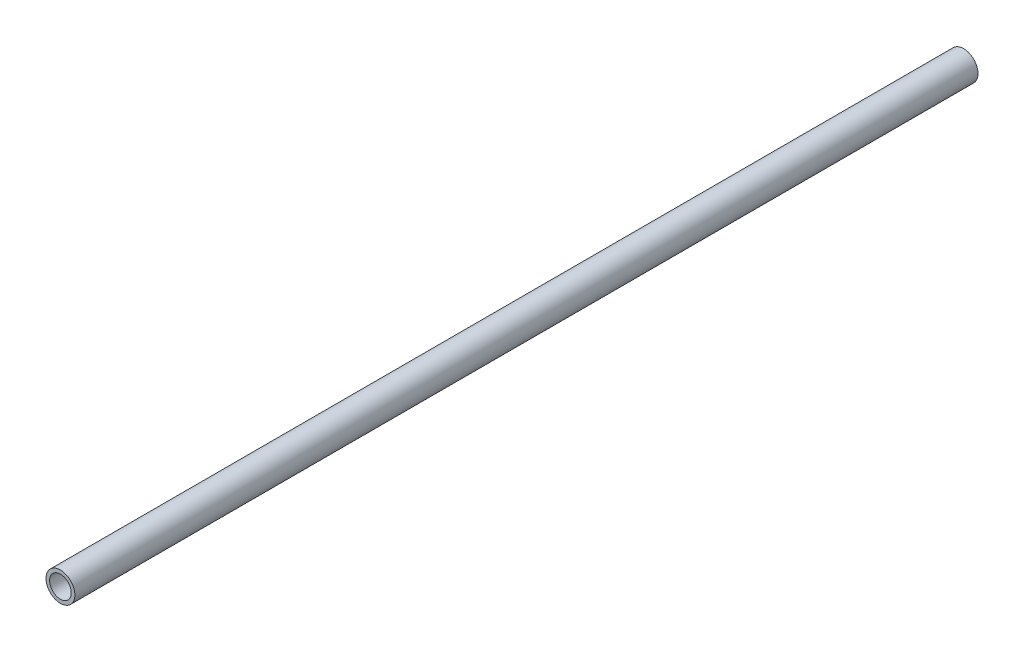
ISO-10303-21;
HEADER;
FILE_DESCRIPTION(('STEP AP214'),'2;1');
FILE_NAME('part.step','',(''),(''),'','','');
FILE_SCHEMA(('AUTOMOTIVE_DESIGN { 1 0 10303 214 1 1 1 1 }'));
ENDSEC;
DATA;
#1=APPLICATION_CONTEXT('core data for automotive mechanical design processes');
#2=APPLICATION_PROTOCOL_DEFINITION('international standard','automotive_design',2000,#1);
#3=PRODUCT_CONTEXT('',#1,'mechanical');
#4=PRODUCT('Part','Part','',(#3));
#5=PRODUCT_RELATED_PRODUCT_CATEGORY('part','',(#4));
#6=PRODUCT_DEFINITION_FORMATION('','',#4);
#7=PRODUCT_DEFINITION_CONTEXT('part definition',#1,'design');
#8=PRODUCT_DEFINITION('design','',#6,#7);
#9=PRODUCT_DEFINITION_SHAPE('','',#8);
#10=(LENGTH_UNIT() NAMED_UNIT(*) SI_UNIT(.MILLI.,.METRE.));
#11=(NAMED_UNIT(*) PLANE_ANGLE_UNIT() SI_UNIT($,.RADIAN.));
#12=(NAMED_UNIT(*) SI_UNIT($,.STERADIAN.) SOLID_ANGLE_UNIT());
#13=UNCERTAINTY_MEASURE_WITH_UNIT(LENGTH_MEASURE(1.E-05),#10,'distance_accuracy_value','');
#14=(GEOMETRIC_REPRESENTATION_CONTEXT(3) GLOBAL_UNCERTAINTY_ASSIGNED_CONTEXT((#13)) GLOBAL_UNIT_ASSIGNED_CONTEXT((#10,
#11,#12)) REPRESENTATION_CONTEXT('',''));
#15=CARTESIAN_POINT('',(0.,0.,0.));
#16=DIRECTION('',(0.,0.,1.));
#17=DIRECTION('',(1.,0.,0.));
#18=AXIS2_PLACEMENT_3D('',#15,#16,#17);
#19=CARTESIAN_POINT('',(0.,0.,250.));
#20=DIRECTION('',(0.,0.,1.));
#21=DIRECTION('',(1.,0.,0.));
#22=AXIS2_PLACEMENT_3D('',#19,#20,#21);
#23=PLANE('',#22);
#24=CARTESIAN_POINT('',(0.,0.,250.));
#25=DIRECTION('',(0.,0.,1.));
#26=DIRECTION('',(1.,0.,0.));
#27=AXIS2_PLACEMENT_3D('',#24,#25,#26);
#28=CIRCLE('',#27,4.);
#29=CARTESIAN_POINT('',(4.,0.,250.));
#30=VERTEX_POINT('',#29);
#31=EDGE_CURVE('E10',#30,#30,#28,.T.);
#32=ORIENTED_EDGE('',*,*,#31,.T.);
#33=EDGE_LOOP('',(#32));
#34=FACE_BOUND('',#33,.T.);
#35=CARTESIAN_POINT('',(0.,0.,250.));
#36=DIRECTION('',(0.,0.,1.));
#37=DIRECTION('',(1.,0.,0.));
#38=AXIS2_PLACEMENT_3D('',#35,#36,#37);
#39=CIRCLE('',#38,3.);
#40=CARTESIAN_POINT('',(3.,0.,250.));
#41=VERTEX_POINT('',#40);
#42=EDGE_CURVE('E42',#41,#41,#39,.T.);
#43=ORIENTED_EDGE('',*,*,#42,.F.);
#44=EDGE_LOOP('',(#43));
#45=FACE_BOUND('',#44,.T.);
#46=ADVANCED_FACE('F31',(#34,#45),#23,.T.);
#47=CARTESIAN_POINT('',(0.,0.,0.));
#48=DIRECTION('',(0.,0.,1.));
#49=DIRECTION('',(1.,0.,0.));
#50=AXIS2_PLACEMENT_3D('',#47,#48,#49);
#51=PLANE('',#50);
#52=CARTESIAN_POINT('',(0.,0.,0.));
#53=DIRECTION('',(0.,0.,1.));
#54=DIRECTION('',(1.,0.,0.));
#55=AXIS2_PLACEMENT_3D('',#52,#53,#54);
#56=CIRCLE('',#55,4.);
#57=CARTESIAN_POINT('',(4.,0.,0.));
#58=VERTEX_POINT('',#57);
#59=EDGE_CURVE('E35',#58,#58,#56,.T.);
#60=ORIENTED_EDGE('',*,*,#59,.F.);
#61=EDGE_LOOP('',(#60));
#62=FACE_BOUND('',#61,.T.);
#63=CARTESIAN_POINT('',(0.,0.,0.));
#64=DIRECTION('',(0.,0.,1.));
#65=DIRECTION('',(1.,0.,0.));
#66=AXIS2_PLACEMENT_3D('',#63,#64,#65);
#67=CIRCLE('',#66,3.);
#68=CARTESIAN_POINT('',(3.,0.,0.));
#69=VERTEX_POINT('',#68);
#70=EDGE_CURVE('E44',#69,#69,#67,.T.);
#71=ORIENTED_EDGE('',*,*,#70,.T.);
#72=EDGE_LOOP('',(#71));
#73=FACE_BOUND('',#72,.T.);
#74=ADVANCED_FACE('F54',(#62,#73),#51,.F.);
#75=CARTESIAN_POINT('',(0.,0.,250.));
#76=DIRECTION('',(0.,0.,-1.));
#77=DIRECTION('',(-1.,0.,0.));
#78=AXIS2_PLACEMENT_3D('',#75,#76,#77);
#79=CYLINDRICAL_SURFACE('',#78,4.);
#80=ORIENTED_EDGE('',*,*,#31,.F.);
#81=EDGE_LOOP('',(#80));
#82=FACE_BOUND('',#81,.T.);
#83=ORIENTED_EDGE('',*,*,#59,.T.);
#84=EDGE_LOOP('',(#83));
#85=FACE_BOUND('',#84,.T.);
#86=ADVANCED_FACE('F33',(#82,#85),#79,.T.);
#87=CARTESIAN_POINT('',(0.,0.,250.));
#88=DIRECTION('',(0.,0.,-1.));
#89=DIRECTION('',(-1.,0.,0.));
#90=AXIS2_PLACEMENT_3D('',#87,#88,#89);
#91=CYLINDRICAL_SURFACE('',#90,3.);
#92=ORIENTED_EDGE('',*,*,#42,.T.);
#93=EDGE_LOOP('',(#92));
#94=FACE_BOUND('',#93,.T.);
#95=ORIENTED_EDGE('',*,*,#70,.F.);
#96=EDGE_LOOP('',(#95));
#97=FACE_BOUND('',#96,.T.);
#98=ADVANCED_FACE('F50',(#94,#97),#91,.F.);
#99=CLOSED_SHELL('',(#46,#74,#86,#98));
#100=MANIFOLD_SOLID_BREP('B2',#99);
#101=ADVANCED_BREP_SHAPE_REPRESENTATION('',(#18,#100),#14);
#102=SHAPE_DEFINITION_REPRESENTATION(#9,#101);
ENDSEC;
END-ISO-10303-21;
